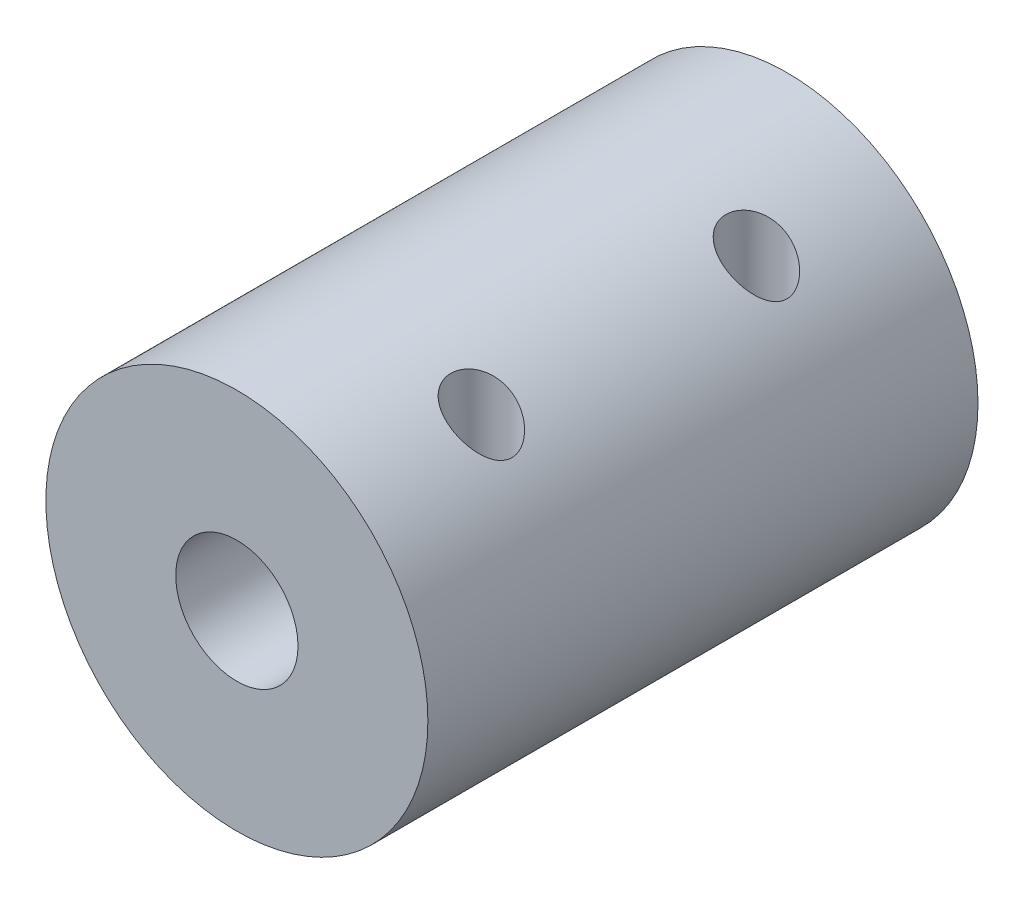
ISO-10303-21;
HEADER;
FILE_DESCRIPTION(('STEP AP214'),'2;1');
FILE_NAME('part.step','',(''),(''),'','','');
FILE_SCHEMA(('AUTOMOTIVE_DESIGN { 1 0 10303 214 1 1 1 1 }'));
ENDSEC;
DATA;
#1=APPLICATION_CONTEXT('core data for automotive mechanical design processes');
#2=APPLICATION_PROTOCOL_DEFINITION('international standard','automotive_design',2000,#1);
#3=PRODUCT_CONTEXT('',#1,'mechanical');
#4=PRODUCT('Part','Part','',(#3));
#5=PRODUCT_RELATED_PRODUCT_CATEGORY('part','',(#4));
#6=PRODUCT_DEFINITION_FORMATION('','',#4);
#7=PRODUCT_DEFINITION_CONTEXT('part definition',#1,'design');
#8=PRODUCT_DEFINITION('design','',#6,#7);
#9=PRODUCT_DEFINITION_SHAPE('','',#8);
#10=(LENGTH_UNIT() NAMED_UNIT(*) SI_UNIT(.MILLI.,.METRE.));
#11=(NAMED_UNIT(*) PLANE_ANGLE_UNIT() SI_UNIT($,.RADIAN.));
#12=(NAMED_UNIT(*) SI_UNIT($,.STERADIAN.) SOLID_ANGLE_UNIT());
#13=UNCERTAINTY_MEASURE_WITH_UNIT(LENGTH_MEASURE(1.E-05),#10,'distance_accuracy_value','');
#14=(GEOMETRIC_REPRESENTATION_CONTEXT(3) GLOBAL_UNCERTAINTY_ASSIGNED_CONTEXT((#13)) GLOBAL_UNIT_ASSIGNED_CONTEXT((#10,
#11,#12)) REPRESENTATION_CONTEXT('',''));
#15=CARTESIAN_POINT('',(0.,0.,0.));
#16=DIRECTION('',(0.,0.,1.));
#17=DIRECTION('',(1.,0.,0.));
#18=AXIS2_PLACEMENT_3D('',#15,#16,#17);
#19=CARTESIAN_POINT('',(0.,0.,36.));
#20=DIRECTION('',(0.,0.,-1.));
#21=DIRECTION('',(-1.,0.,0.));
#22=AXIS2_PLACEMENT_3D('',#19,#20,#21);
#23=CYLINDRICAL_SURFACE('',#22,12.5);
#24=CARTESIAN_POINT('',(7.,-10.356157588604,29.));
#25=CARTESIAN_POINT('',(7.14068387193345,-10.2610607831514,28.9999991687884));
#26=CARTESIAN_POINT('',(7.27945191704366,-10.1630485384281,28.9851627128638));
#27=CARTESIAN_POINT('',(7.5493225794935,-9.96423262998421,28.928037127534));
#28=CARTESIAN_POINT('',(7.68041202746763,-9.8634245836727,28.8857022572878));
#29=CARTESIAN_POINT('',(7.93057620345984,-9.66340435584903,28.775543183503));
#30=CARTESIAN_POINT('',(8.04974800522251,-9.56418596724444,28.7079506162662));
#31=CARTESIAN_POINT('',(8.27428923661972,-9.3705917835191,28.5476370368059));
#32=CARTESIAN_POINT('',(8.37968125796683,-9.27620822035086,28.4549579394991));
#33=CARTESIAN_POINT('',(8.54188192502925,-9.12657325446701,28.277537683825));
#34=CARTESIAN_POINT('',(8.60349144749399,-9.06841203731702,28.1996193355585));
#35=CARTESIAN_POINT('',(8.71634059006958,-8.95999383544148,28.0316841714565));
#36=CARTESIAN_POINT('',(8.76759759425184,-8.90972363220626,27.9416880670313));
#37=CARTESIAN_POINT('',(8.84728644704714,-8.83051410239155,27.7709543120237));
#38=CARTESIAN_POINT('',(8.87825805132102,-8.79931346827258,27.6924638163142));
#39=CARTESIAN_POINT('',(8.93057793813701,-8.74620905716096,27.5293252147775));
#40=CARTESIAN_POINT('',(8.95193428226708,-8.72429749296717,27.4446823366279));
#41=CARTESIAN_POINT('',(8.98361868916704,-8.69167046593195,27.2704561851858));
#42=CARTESIAN_POINT('',(8.99385654870469,-8.68104659390032,27.1808386136893));
#43=CARTESIAN_POINT('',(9.00203296103069,-8.67256861283873,27.0004540778367));
#44=CARTESIAN_POINT('',(8.99997814932987,-8.67470761448384,26.9096877599679));
#45=CARTESIAN_POINT('',(8.98480889346025,-8.69041383371224,26.7416133734866));
#46=CARTESIAN_POINT('',(8.97309659702743,-8.70253193303169,26.6640314469692));
#47=CARTESIAN_POINT('',(8.94122473192908,-8.73527444626934,26.5125072360417));
#48=CARTESIAN_POINT('',(8.92106126372871,-8.75590278690913,26.4385666494395));
#49=CARTESIAN_POINT('',(8.86539520735703,-8.8123095566044,26.2717132154406));
#50=CARTESIAN_POINT('',(8.8270197305425,-8.85084614964855,26.1806956486412));
#51=CARTESIAN_POINT('',(8.73968795989364,-8.93709304958367,26.0086148645631));
#52=CARTESIAN_POINT('',(8.69070931490208,-8.98482271137623,25.9275732511951));
#53=CARTESIAN_POINT('',(8.56514136233976,-9.10485068886872,25.7485200915353));
#54=CARTESIAN_POINT('',(8.48494825604652,-9.17982282875852,25.6548392589619));
#55=CARTESIAN_POINT('',(8.31247594685514,-9.33629286145143,25.4860668513366));
#56=CARTESIAN_POINT('',(8.22018564190364,-9.41779672162827,25.4109925374041));
#57=CARTESIAN_POINT('',(8.02357310027397,-9.58589530681733,25.2775796959447));
#58=CARTESIAN_POINT('',(7.91901641129684,-9.67256508575966,25.2196829876754));
#59=CARTESIAN_POINT('',(7.70171754001083,-9.84646846736119,25.1233754677321));
#60=CARTESIAN_POINT('',(7.58897317899799,-9.93370221442289,25.0849698644346));
#61=CARTESIAN_POINT('',(7.33818235453746,-10.120738008913,25.0239166269127));
#62=CARTESIAN_POINT('',(7.19901873913846,-10.2202549905566,25.0048863065314));
#63=CARTESIAN_POINT('',(6.91604469592688,-10.4138183921674,24.9967689762827));
#64=CARTESIAN_POINT('',(6.77223814738207,-10.5078692041919,25.0076575772235));
#65=CARTESIAN_POINT('',(6.5161616144922,-10.6680536438183,25.0560236397253));
#66=CARTESIAN_POINT('',(6.40375035426118,-10.7358454253372,25.0872898217083));
#67=CARTESIAN_POINT('',(6.1827954079844,-10.8645912790763,25.1707658784394));
#68=CARTESIAN_POINT('',(6.07424963648994,-10.9255490775977,25.2229642679118));
#69=CARTESIAN_POINT('',(5.8645605017398,-11.0395326046532,25.3489900884843));
#70=CARTESIAN_POINT('',(5.76347134456054,-11.0925027114384,25.4229594699766));
#71=CARTESIAN_POINT('',(5.57454119432858,-11.1886433911291,25.5914379442593));
#72=CARTESIAN_POINT('',(5.48669208466121,-11.2318199760745,25.6859343657873));
#73=CARTESIAN_POINT('',(5.33894348121724,-11.3027249931006,25.8802093165887));
#74=CARTESIAN_POINT('',(5.27694214638591,-11.331695108258,25.9779389684692));
#75=CARTESIAN_POINT('',(5.17016759663191,-11.3808102147578,26.1844074041899));
#76=CARTESIAN_POINT('',(5.12538346618895,-11.400960798713,26.2931391573929));
#77=CARTESIAN_POINT('',(5.0586153069291,-11.4307316583864,26.5075908106945));
#78=CARTESIAN_POINT('',(5.03491373738841,-11.4411496919547,26.6126686805542));
#79=CARTESIAN_POINT('',(5.00470730439503,-11.4543959309208,26.8257277991635));
#80=CARTESIAN_POINT('',(4.99819731191654,-11.4572264000365,26.9337081722506));
#81=CARTESIAN_POINT('',(5.0025757258797,-11.4553146902739,27.1450358504908));
#82=CARTESIAN_POINT('',(5.01279915176864,-11.4508619485022,27.2484004220872));
#83=CARTESIAN_POINT('',(5.04895867227183,-11.4349640037868,27.4517771009807));
#84=CARTESIAN_POINT('',(5.07489364493005,-11.4235193001361,27.551789447121));
#85=CARTESIAN_POINT('',(5.14141356913551,-11.3937344105042,27.7457732322189));
#86=CARTESIAN_POINT('',(5.18200652777749,-11.3753904554988,27.8397413363219));
#87=CARTESIAN_POINT('',(5.27619990327184,-11.3320074197615,28.0192095279428));
#88=CARTESIAN_POINT('',(5.32980145277784,-11.3069677560172,28.1047088771757));
#89=CARTESIAN_POINT('',(5.45010335028842,-11.2494871275566,28.2682638956897));
#90=CARTESIAN_POINT('',(5.51720596125261,-11.2168120620838,28.3459405294287));
#91=CARTESIAN_POINT('',(5.66066533210741,-11.1451018398242,28.4887710201233));
#92=CARTESIAN_POINT('',(5.73702462739475,-11.1060649395244,28.5539214334659));
#93=CARTESIAN_POINT('',(5.90255428361997,-11.0190395197891,28.6753926101115));
#94=CARTESIAN_POINT('',(5.99225778579438,-10.9705947385086,28.7306571541901));
#95=CARTESIAN_POINT('',(6.17647446366748,-10.8679481490624,28.8255287854253));
#96=CARTESIAN_POINT('',(6.27098922492202,-10.8137444365526,28.8651306727354));
#97=CARTESIAN_POINT('',(6.47126376452669,-10.6952093641346,28.9319948051489));
#98=CARTESIAN_POINT('',(6.57724545122525,-10.6304049492869,28.9577472294249));
#99=CARTESIAN_POINT('',(6.78917306580394,-10.4963282599225,28.9917558442504));
#100=CARTESIAN_POINT('',(6.89511892534949,-10.4270531007521,29.0000006196757));
#101=CARTESIAN_POINT('',(7.,-10.356157588604,29.));
#102=B_SPLINE_CURVE_WITH_KNOTS('',3,(#24,#25,#26,#27,#28,#29,#30,#31,#32,#33,#34,#35,#36,#37,
#38,#39,#40,#41,#42,#43,#44,#45,#46,#47,#48,#49,#50,#51,#52,#53,#54,#55,#56,#57,#58,#59,#60,#61,
#62,#63,#64,#65,#66,#67,#68,#69,#70,#71,#72,#73,#74,#75,#76,#77,#78,#79,#80,#81,#82,#83,#84,#85,
#86,#87,#88,#89,#90,#91,#92,#93,#94,#95,#96,#97,#98,#99,#100,#101),.UNSPECIFIED.,.T.,.F.,(4,2,2,
2,2,2,2,2,2,2,2,2,2,2,2,2,2,2,2,2,2,2,2,2,2,2,2,2,2,2,2,2,2,2,2,2,2,2,4),(0.,0.508942910983598,
1.01873457270369,1.52396135302172,2.0283491492011,2.37258912968714,2.71624616231806,
2.9851176741172,3.25376333802494,3.52457258278402,3.79523565951812,4.03235620136885,
4.26958627590508,4.58592234742726,4.90293185411265,5.33357989902241,5.76462596975843,
6.20595178474925,6.64739546798559,7.16123669072035,7.67465916663005,8.07783786096845,
8.48079563754667,8.88644127596495,9.2918372188986,9.64780382425531,10.0035443770221,
10.3265816113565,10.6495224581642,10.9599384938928,11.2703323655338,11.5808960505646,
11.8914867859781,12.2132646316257,12.5351308118912,12.8816107559385,13.2282056315231,
13.6073799381176,13.9868013935135),.UNSPECIFIED.);
#103=CARTESIAN_POINT('',(7.,-10.356157588604,29.));
#104=VERTEX_POINT('',#103);
#105=EDGE_CURVE('E35',#104,#104,#102,.T.);
#106=ORIENTED_EDGE('',*,*,#105,.T.);
#107=EDGE_LOOP('',(#106));
#108=FACE_BOUND('',#107,.T.);
#109=CARTESIAN_POINT('',(7.,10.356157588604,29.));
#110=CARTESIAN_POINT('',(6.85864170600559,10.4517003004259,28.9999980410257));
#111=CARTESIAN_POINT('',(6.71502019314042,10.5445144214495,28.9850019215207));
#112=CARTESIAN_POINT('',(6.42908294498435,10.721245678618,28.9223553074628));
#113=CARTESIAN_POINT('',(6.28676822293428,10.8051563690134,28.8746813391453));
#114=CARTESIAN_POINT('',(6.05068071029089,10.9385623381134,28.763697209647));
#115=CARTESIAN_POINT('',(5.95464779243153,10.9910442601749,28.7087351146585));
#116=CARTESIAN_POINT('',(5.77070086151919,11.0887247382329,28.5815477478037));
#117=CARTESIAN_POINT('',(5.68277764099052,11.1339315986422,28.5093423962994));
#118=CARTESIAN_POINT('',(5.51825047898149,11.2163921033686,28.3482364307157));
#119=CARTESIAN_POINT('',(5.44170812907981,11.2536029249184,28.2592504926383));
#120=CARTESIAN_POINT('',(5.30426376808096,11.3190373277017,28.0669698566305));
#121=CARTESIAN_POINT('',(5.24335857897028,11.3472627353632,27.9636780727239));
#122=CARTESIAN_POINT('',(5.14525530882304,11.3920584046786,27.7562092138656));
#123=CARTESIAN_POINT('',(5.10638221654841,11.4094669311576,27.6530030137724));
#124=CARTESIAN_POINT('',(5.04602983943971,11.4362882426599,27.4406454786878));
#125=CARTESIAN_POINT('',(5.02454319881512,11.4457044091414,27.33149667875));
#126=CARTESIAN_POINT('',(5.00069463378965,11.4561428411698,27.1171746211857));
#127=CARTESIAN_POINT('',(4.9972971376342,11.4576196708426,27.0121372384528));
#128=CARTESIAN_POINT('',(5.00697782661207,11.4533925825104,26.8029805280116));
#129=CARTESIAN_POINT('',(5.02005340523484,11.4476898005249,26.6988610576882));
#130=CARTESIAN_POINT('',(5.06180617889699,11.4292878784105,26.4960439990539));
#131=CARTESIAN_POINT('',(5.09025440763718,11.4166913816704,26.3972896855164));
#132=CARTESIAN_POINT('',(5.16142399611857,11.3846921274331,26.2062557999199));
#133=CARTESIAN_POINT('',(5.20414576355298,11.3652891755232,26.1139764128944));
#134=CARTESIAN_POINT('',(5.30320233111028,11.3194113236213,25.9363089536228));
#135=CARTESIAN_POINT('',(5.35980442021887,11.2927963341017,25.8511065271126));
#136=CARTESIAN_POINT('',(5.48392220240138,11.233046445824,25.6916717957965));
#137=CARTESIAN_POINT('',(5.55143990884507,11.1999103440107,25.6174415196322));
#138=CARTESIAN_POINT('',(5.69922860195431,11.1254671099667,25.4771823927175));
#139=CARTESIAN_POINT('',(5.7800166915783,11.0837935108601,25.4118947193529));
#140=CARTESIAN_POINT('',(5.9483103842781,10.9943935526225,25.2957653625911));
#141=CARTESIAN_POINT('',(6.03581837634319,10.9466650369425,25.2449288471996));
#142=CARTESIAN_POINT('',(6.22409009157505,10.840825637162,25.1533792827514));
#143=CARTESIAN_POINT('',(6.32529519292712,10.7821522807799,25.1142289475962));
#144=CARTESIAN_POINT('',(6.52969968210528,10.6596085328827,25.0531527200896));
#145=CARTESIAN_POINT('',(6.63289997837478,10.5957357293586,25.0312348726712));
#146=CARTESIAN_POINT('',(6.85332046050655,10.4547308612595,25.0018719043338));
#147=CARTESIAN_POINT('',(6.97048016687871,10.3769945744666,24.9968833004432));
#148=CARTESIAN_POINT('',(7.2015314630778,10.2180069168697,25.0068169076139));
#149=CARTESIAN_POINT('',(7.31542070806022,10.136753123841,25.0217530572665));
#150=CARTESIAN_POINT('',(7.55408934176237,9.96046236894666,25.0738608667545));
#151=CARTESIAN_POINT('',(7.67802712191999,9.86514680786726,25.1139636508165));
#152=CARTESIAN_POINT('',(7.91628559313228,9.67500188546217,25.2174989033131));
#153=CARTESIAN_POINT('',(8.03060152960583,9.58017278600077,25.2809428234389));
#154=CARTESIAN_POINT('',(8.23430014370588,9.40543338674523,25.4220201562348));
#155=CARTESIAN_POINT('',(8.3250360535662,9.32507195580157,25.4971399623461));
#156=CARTESIAN_POINT('',(8.49449440383893,9.17096533331161,25.6655641269851));
#157=CARTESIAN_POINT('',(8.57323563768305,9.09720986774516,25.7588395056513));
#158=CARTESIAN_POINT('',(8.69527211091314,8.98038311114333,25.9350631155241));
#159=CARTESIAN_POINT('',(8.74231167299722,8.93451155648619,26.0135552631989));
#160=CARTESIAN_POINT('',(8.82648724553949,8.85136218036659,26.1798804929067));
#161=CARTESIAN_POINT('',(8.86363808549738,8.81407150221076,26.2676993084357));
#162=CARTESIAN_POINT('',(8.92016812933681,8.75682185775056,26.434951109887));
#163=CARTESIAN_POINT('',(8.94154292806273,8.73495105696351,26.5130461659893));
#164=CARTESIAN_POINT('',(8.97481984481278,8.70075784802403,26.6732569250681));
#165=CARTESIAN_POINT('',(8.9867297448157,8.68842759591436,26.7553692659625));
#166=CARTESIAN_POINT('',(9.00021460789662,8.6744590570228,26.9217146353329));
#167=CARTESIAN_POINT('',(9.00174636081666,8.67286547328162,27.0059550663416));
#168=CARTESIAN_POINT('',(8.9942284621604,8.68066126249797,27.1734473171564));
#169=CARTESIAN_POINT('',(8.98517688880933,8.69005263015952,27.256698954639));
#170=CARTESIAN_POINT('',(8.95807548200982,8.71798280615734,27.4147058815619));
#171=CARTESIAN_POINT('',(8.94060612459052,8.73593081367064,27.4896700102873));
#172=CARTESIAN_POINT('',(8.89800518003137,8.77931816320875,27.6350803001795));
#173=CARTESIAN_POINT('',(8.87287005107822,8.80476096786579,27.7055243546898));
#174=CARTESIAN_POINT('',(8.80298217070603,8.87473477283511,27.8722097408472));
#175=CARTESIAN_POINT('',(8.75451882075659,8.92266892130196,27.9654688822837));
#176=CARTESIAN_POINT('',(8.64656322528866,9.02732672617192,28.1399149584861));
#177=CARTESIAN_POINT('',(8.58704527904121,9.08407081321447,28.2210729500898));
#178=CARTESIAN_POINT('',(8.43733616659391,9.2236131873987,28.3969897530838));
#179=CARTESIAN_POINT('',(8.34361129605056,9.30869125451635,28.4869280669421));
#180=CARTESIAN_POINT('',(8.14382362380456,9.4839799217337,28.645589699835));
#181=CARTESIAN_POINT('',(8.03774469812104,9.5741971490313,28.714284856207));
#182=CARTESIAN_POINT('',(7.81373773105778,9.75791375952374,28.8314193140713));
#183=CARTESIAN_POINT('',(7.69562661201302,9.85144298448163,28.8794598690141));
#184=CARTESIAN_POINT('',(7.45184625847072,10.0370980923894,28.9524203932205));
#185=CARTESIAN_POINT('',(7.3262005066824,10.1292273175613,28.9774085882286));
#186=CARTESIAN_POINT('',(7.16544877163779,10.2424588062209,28.993416346721));
#187=CARTESIAN_POINT('',(7.13256317683276,10.2653859987659,28.9958756199482));
#188=CARTESIAN_POINT('',(7.06649376051978,10.3109786484452,28.9991683520258));
#189=CARTESIAN_POINT('',(7.0333097144162,10.3336438728862,29.0000004616134));
#190=CARTESIAN_POINT('',(7.,10.356157588604,29.));
#191=B_SPLINE_CURVE_WITH_KNOTS('',3,(#109,#110,#111,#112,#113,#114,#115,#116,#117,#118,#119,
#120,#121,#122,#123,#124,#125,#126,#127,#128,#129,#130,#131,#132,#133,#134,#135,#136,#137,#138,
#139,#140,#141,#142,#143,#144,#145,#146,#147,#148,#149,#150,#151,#152,#153,#154,#155,#156,#157,
#158,#159,#160,#161,#162,#163,#164,#165,#166,#167,#168,#169,#170,#171,#172,#173,#174,#175,#176,
#177,#178,#179,#180,#181,#182,#183,#184,#185,#186,#187,#188,#189,#190),.UNSPECIFIED.,.T.,.F.,(4,
2,2,2,2,2,2,2,2,2,2,2,2,2,2,2,2,2,2,2,2,2,2,2,2,2,2,2,2,2,2,2,2,2,2,2,2,2,2,2,4),(0.,
0.511662245727429,1.02369242398268,1.38956169001837,1.75501031115094,2.12236983425078,
2.48965463794703,2.82287029345924,3.15594489960562,3.46972882581538,3.78346310868827,
4.09264836773345,4.40184245875175,4.71753631302062,5.0332884631358,5.36764946286998,
5.70212988638153,6.07074717632292,6.43953645208255,6.85996956603498,7.28069695311549,
7.76292395847885,8.24538787155516,8.6716538326899,9.0972448881698,9.4033167217458,
9.70892693895861,9.95950036159474,10.2098675506127,10.4612765241832,10.7127311569776,
10.9488993050068,11.1851767354401,11.5297954916445,11.8752257120312,12.3386232421084,
12.8026325036062,13.2752361596444,13.7464365684803,13.8669049751243,13.9874732332797),.UNSPECIFIED.);
#192=CARTESIAN_POINT('',(7.,10.356157588604,29.));
#193=VERTEX_POINT('',#192);
#194=EDGE_CURVE('E106',#193,#193,#191,.T.);
#195=ORIENTED_EDGE('',*,*,#194,.T.);
#196=EDGE_LOOP('',(#195));
#197=FACE_BOUND('',#196,.T.);
#198=CARTESIAN_POINT('',(7.,-10.356157588604,11.));
#199=CARTESIAN_POINT('',(7.14068387193345,-10.2610607831514,10.9999991687883));
#200=CARTESIAN_POINT('',(7.27945191704366,-10.1630485384281,10.9851627128638));
#201=CARTESIAN_POINT('',(7.5493225794935,-9.96423262998421,10.928037127534));
#202=CARTESIAN_POINT('',(7.68041202746763,-9.8634245836727,10.8857022572878));
#203=CARTESIAN_POINT('',(7.93057620345984,-9.66340435584903,10.775543183503));
#204=CARTESIAN_POINT('',(8.04974800522251,-9.56418596724444,10.7079506162662));
#205=CARTESIAN_POINT('',(8.27428923661972,-9.3705917835191,10.5476370368059));
#206=CARTESIAN_POINT('',(8.37968125796682,-9.27620822035086,10.4549579394991));
#207=CARTESIAN_POINT('',(8.54188192502925,-9.12657325446701,10.277537683825));
#208=CARTESIAN_POINT('',(8.60349144749399,-9.06841203731702,10.1996193355585));
#209=CARTESIAN_POINT('',(8.71634059006958,-8.95999383544148,10.0316841714565));
#210=CARTESIAN_POINT('',(8.76759759425184,-8.90972363220626,9.94168806703126));
#211=CARTESIAN_POINT('',(8.84728644704714,-8.83051410239155,9.77095431202372));
#212=CARTESIAN_POINT('',(8.87825805132102,-8.79931346827258,9.69246381631422));
#213=CARTESIAN_POINT('',(8.93057793813701,-8.74620905716096,9.52932521477746));
#214=CARTESIAN_POINT('',(8.95193428226707,-8.72429749296717,9.44468233662785));
#215=CARTESIAN_POINT('',(8.98361868916704,-8.69167046593195,9.27045618518575));
#216=CARTESIAN_POINT('',(8.99385654870468,-8.68104659390032,9.18083861368924));
#217=CARTESIAN_POINT('',(9.00203296103069,-8.67256861283873,9.00045407783669));
#218=CARTESIAN_POINT('',(8.99997814932987,-8.67470761448384,8.90968775996793));
#219=CARTESIAN_POINT('',(8.98480889346024,-8.69041383371224,8.74161337348663));
#220=CARTESIAN_POINT('',(8.97309659702743,-8.70253193303169,8.66403144696915));
#221=CARTESIAN_POINT('',(8.94122473192908,-8.73527444626935,8.51250723604164));
#222=CARTESIAN_POINT('',(8.92106126372871,-8.75590278690913,8.43856664943952));
#223=CARTESIAN_POINT('',(8.86539520735703,-8.8123095566044,8.27171321544061));
#224=CARTESIAN_POINT('',(8.8270197305425,-8.85084614964855,8.18069564864117));
#225=CARTESIAN_POINT('',(8.73968795989363,-8.93709304958368,8.00861486456303));
#226=CARTESIAN_POINT('',(8.69070931490207,-8.98482271137624,7.92757325119505));
#227=CARTESIAN_POINT('',(8.56514136233975,-9.10485068886872,7.74852009153527));
#228=CARTESIAN_POINT('',(8.48494825604652,-9.17982282875853,7.65483925896191));
#229=CARTESIAN_POINT('',(8.31247594685513,-9.33629286145143,7.48606685133654));
#230=CARTESIAN_POINT('',(8.22018564190364,-9.41779672162827,7.4109925374041));
#231=CARTESIAN_POINT('',(8.02357310027397,-9.58589530681733,7.27757969594472));
#232=CARTESIAN_POINT('',(7.91901641129684,-9.67256508575966,7.21968298767541));
#233=CARTESIAN_POINT('',(7.70171754001082,-9.84646846736119,7.12337546773208));
#234=CARTESIAN_POINT('',(7.58897317899798,-9.93370221442289,7.08496986443462));
#235=CARTESIAN_POINT('',(7.33818235453745,-10.120738008913,7.02391662691266));
#236=CARTESIAN_POINT('',(7.19901873913845,-10.2202549905566,7.00488630653143));
#237=CARTESIAN_POINT('',(6.91604469592688,-10.4138183921674,6.99676897628271));
#238=CARTESIAN_POINT('',(6.77223814738206,-10.5078692041919,7.0076575772235));
#239=CARTESIAN_POINT('',(6.51616161449219,-10.6680536438183,7.05602363972526));
#240=CARTESIAN_POINT('',(6.40375035426118,-10.7358454253372,7.08728982170824));
#241=CARTESIAN_POINT('',(6.18279540798439,-10.8645912790763,7.17076587843936));
#242=CARTESIAN_POINT('',(6.07424963648993,-10.9255490775977,7.22296426791179));
#243=CARTESIAN_POINT('',(5.86456050173979,-11.0395326046532,7.34899008848432));
#244=CARTESIAN_POINT('',(5.76347134456054,-11.0925027114384,7.42295946997661));
#245=CARTESIAN_POINT('',(5.57454119432857,-11.1886433911291,7.59143794425925));
#246=CARTESIAN_POINT('',(5.4866920846612,-11.2318199760745,7.68593436578733));
#247=CARTESIAN_POINT('',(5.33894348121724,-11.3027249931006,7.88020931658869));
#248=CARTESIAN_POINT('',(5.27694214638591,-11.331695108258,7.97793896846915));
#249=CARTESIAN_POINT('',(5.17016759663191,-11.3808102147578,8.18440740418991));
#250=CARTESIAN_POINT('',(5.12538346618895,-11.400960798713,8.29313915739292));
#251=CARTESIAN_POINT('',(5.0586153069291,-11.4307316583864,8.50759081069453));
#252=CARTESIAN_POINT('',(5.03491373738841,-11.4411496919547,8.61266868055422));
#253=CARTESIAN_POINT('',(5.00470730439503,-11.4543959309208,8.82572779916346));
#254=CARTESIAN_POINT('',(4.99819731191654,-11.4572264000365,8.93370817225064));
#255=CARTESIAN_POINT('',(5.0025757258797,-11.4553146902739,9.14503585049081));
#256=CARTESIAN_POINT('',(5.01279915176864,-11.4508619485022,9.24840042208715));
#257=CARTESIAN_POINT('',(5.04895867227183,-11.4349640037868,9.4517771009807));
#258=CARTESIAN_POINT('',(5.07489364493005,-11.4235193001361,9.55178944712102));
#259=CARTESIAN_POINT('',(5.14141356913551,-11.3937344105042,9.74577323221886));
#260=CARTESIAN_POINT('',(5.18200652777749,-11.3753904554988,9.83974133632189));
#261=CARTESIAN_POINT('',(5.27619990327185,-11.3320074197615,10.0192095279428));
#262=CARTESIAN_POINT('',(5.32980145277785,-11.3069677560172,10.1047088771757));
#263=CARTESIAN_POINT('',(5.45010335028843,-11.2494871275566,10.2682638956896));
#264=CARTESIAN_POINT('',(5.51720596125261,-11.2168120620838,10.3459405294287));
#265=CARTESIAN_POINT('',(5.66066533210742,-11.1451018398242,10.4887710201232));
#266=CARTESIAN_POINT('',(5.73702462739475,-11.1060649395244,10.5539214334659));
#267=CARTESIAN_POINT('',(5.90255428361997,-11.0190395197891,10.6753926101115));
#268=CARTESIAN_POINT('',(5.99225778579439,-10.9705947385086,10.7306571541901));
#269=CARTESIAN_POINT('',(6.17647446366749,-10.8679481490624,10.8255287854253));
#270=CARTESIAN_POINT('',(6.27098922492202,-10.8137444365526,10.8651306727354));
#271=CARTESIAN_POINT('',(6.47126376452669,-10.6952093641346,10.9319948051488));
#272=CARTESIAN_POINT('',(6.57724545122526,-10.6304049492869,10.9577472294249));
#273=CARTESIAN_POINT('',(6.78917306580394,-10.4963282599225,10.9917558442503));
#274=CARTESIAN_POINT('',(6.89511892534949,-10.4270531007521,11.0000006196757));
#275=CARTESIAN_POINT('',(7.,-10.356157588604,11.));
#276=B_SPLINE_CURVE_WITH_KNOTS('',3,(#198,#199,#200,#201,#202,#203,#204,#205,#206,#207,#208,
#209,#210,#211,#212,#213,#214,#215,#216,#217,#218,#219,#220,#221,#222,#223,#224,#225,#226,#227,
#228,#229,#230,#231,#232,#233,#234,#235,#236,#237,#238,#239,#240,#241,#242,#243,#244,#245,#246,
#247,#248,#249,#250,#251,#252,#253,#254,#255,#256,#257,#258,#259,#260,#261,#262,#263,#264,#265,
#266,#267,#268,#269,#270,#271,#272,#273,#274,#275),.UNSPECIFIED.,.T.,.F.,(4,2,2,2,2,2,2,2,2,2,2,
2,2,2,2,2,2,2,2,2,2,2,2,2,2,2,2,2,2,2,2,2,2,2,2,2,2,2,4),(0.,0.508942910983598,1.01873457270368,
1.52396135302172,2.0283491492011,2.37258912968714,2.71624616231806,2.9851176741172,
3.25376333802494,3.52457258278402,3.79523565951812,4.03235620136884,4.26958627590508,
4.58592234742726,4.90293185411265,5.33357989902241,5.76462596975843,6.20595178474925,
6.64739546798559,7.16123669072035,7.67465916663005,8.07783786096845,8.48079563754667,
8.88644127596495,9.29183721889859,9.64780382425531,10.0035443770221,10.3265816113565,
10.6495224581642,10.9599384938928,11.2703323655338,11.5808960505646,11.8914867859781,
12.2132646316257,12.5351308118912,12.8816107559385,13.2282056315231,13.6073799381176,
13.9868013935135),.UNSPECIFIED.);
#277=CARTESIAN_POINT('',(7.,-10.356157588604,11.));
#278=VERTEX_POINT('',#277);
#279=EDGE_CURVE('E57',#278,#278,#276,.T.);
#280=ORIENTED_EDGE('',*,*,#279,.T.);
#281=EDGE_LOOP('',(#280));
#282=FACE_BOUND('',#281,.T.);
#283=CARTESIAN_POINT('',(7.,10.356157588604,11.));
#284=CARTESIAN_POINT('',(6.85864170600559,10.4517003004259,10.9999980410257));
#285=CARTESIAN_POINT('',(6.71502019314042,10.5445144214494,10.9850019215206));
#286=CARTESIAN_POINT('',(6.42908294498435,10.721245678618,10.9223553074627));
#287=CARTESIAN_POINT('',(6.28676822293428,10.8051563690134,10.8746813391453));
#288=CARTESIAN_POINT('',(6.05068071029089,10.9385623381134,10.763697209647));
#289=CARTESIAN_POINT('',(5.95464779243153,10.9910442601749,10.7087351146585));
#290=CARTESIAN_POINT('',(5.77070086151919,11.0887247382329,10.5815477478037));
#291=CARTESIAN_POINT('',(5.68277764099052,11.1339315986422,10.5093423962993));
#292=CARTESIAN_POINT('',(5.51825047898149,11.2163921033686,10.3482364307157));
#293=CARTESIAN_POINT('',(5.44170812907981,11.2536029249184,10.2592504926383));
#294=CARTESIAN_POINT('',(5.30426376808096,11.3190373277017,10.0669698566305));
#295=CARTESIAN_POINT('',(5.24335857897029,11.3472627353632,9.96367807272388));
#296=CARTESIAN_POINT('',(5.14525530882305,11.3920584046786,9.7562092138656));
#297=CARTESIAN_POINT('',(5.10638221654841,11.4094669311576,9.65300301377238));
#298=CARTESIAN_POINT('',(5.04602983943971,11.4362882426599,9.4406454786878));
#299=CARTESIAN_POINT('',(5.02454319881513,11.4457044091414,9.33149667874996));
#300=CARTESIAN_POINT('',(5.00069463378965,11.4561428411698,9.11717462118571));
#301=CARTESIAN_POINT('',(4.99729713763421,11.4576196708426,9.01213723845277));
#302=CARTESIAN_POINT('',(5.00697782661207,11.4533925825104,8.8029805280116));
#303=CARTESIAN_POINT('',(5.02005340523484,11.4476898005249,8.69886105768819));
#304=CARTESIAN_POINT('',(5.06180617889699,11.4292878784105,8.49604399905387));
#305=CARTESIAN_POINT('',(5.09025440763718,11.4166913816704,8.39728968551639));
#306=CARTESIAN_POINT('',(5.16142399611857,11.3846921274331,8.20625579991987));
#307=CARTESIAN_POINT('',(5.20414576355298,11.3652891755232,8.11397641289443));
#308=CARTESIAN_POINT('',(5.30320233111029,11.3194113236213,7.93630895362278));
#309=CARTESIAN_POINT('',(5.35980442021887,11.2927963341017,7.85110652711263));
#310=CARTESIAN_POINT('',(5.48392220240138,11.233046445824,7.69167179579645));
#311=CARTESIAN_POINT('',(5.55143990884507,11.1999103440107,7.61744151963214));
#312=CARTESIAN_POINT('',(5.69922860195431,11.1254671099667,7.47718239271746));
#313=CARTESIAN_POINT('',(5.7800166915783,11.0837935108601,7.41189471935286));
#314=CARTESIAN_POINT('',(5.9483103842781,10.9943935526225,7.29576536259113));
#315=CARTESIAN_POINT('',(6.03581837634319,10.9466650369425,7.24492884719957));
#316=CARTESIAN_POINT('',(6.22409009157505,10.840825637162,7.15337928275137));
#317=CARTESIAN_POINT('',(6.32529519292712,10.7821522807799,7.11422894759621));
#318=CARTESIAN_POINT('',(6.52969968210529,10.6596085328827,7.05315272008956));
#319=CARTESIAN_POINT('',(6.63289997837478,10.5957357293586,7.03123487267121));
#320=CARTESIAN_POINT('',(6.85332046050655,10.4547308612595,7.00187190433381));
#321=CARTESIAN_POINT('',(6.97048016687871,10.3769945744666,6.99688330044317));
#322=CARTESIAN_POINT('',(7.2015314630778,10.2180069168697,7.0068169076139));
#323=CARTESIAN_POINT('',(7.31542070806022,10.136753123841,7.02175305726646));
#324=CARTESIAN_POINT('',(7.55408934176237,9.96046236894666,7.0738608667545));
#325=CARTESIAN_POINT('',(7.67802712192,9.86514680786725,7.11396365081646));
#326=CARTESIAN_POINT('',(7.91628559313228,9.67500188546217,7.21749890331309));
#327=CARTESIAN_POINT('',(8.03060152960583,9.58017278600077,7.28094282343886));
#328=CARTESIAN_POINT('',(8.23430014370588,9.40543338674523,7.4220201562348));
#329=CARTESIAN_POINT('',(8.3250360535662,9.32507195580157,7.49713996234608));
#330=CARTESIAN_POINT('',(8.49449440383893,9.17096533331161,7.66556412698505));
#331=CARTESIAN_POINT('',(8.57323563768305,9.09720986774516,7.75883950565129));
#332=CARTESIAN_POINT('',(8.69527211091314,8.98038311114334,7.93506311552405));
#333=CARTESIAN_POINT('',(8.74231167299722,8.93451155648619,8.01355526319891));
#334=CARTESIAN_POINT('',(8.82648724553949,8.8513621803666,8.17988049290669));
#335=CARTESIAN_POINT('',(8.86363808549738,8.81407150221076,8.2676993084357));
#336=CARTESIAN_POINT('',(8.92016812933681,8.75682185775057,8.43495110988696));
#337=CARTESIAN_POINT('',(8.94154292806273,8.73495105696352,8.51304616598928));
#338=CARTESIAN_POINT('',(8.97481984481278,8.70075784802403,8.67325692506807));
#339=CARTESIAN_POINT('',(8.9867297448157,8.68842759591436,8.75536926596251));
#340=CARTESIAN_POINT('',(9.00021460789662,8.6744590570228,8.92171463533285));
#341=CARTESIAN_POINT('',(9.00174636081666,8.67286547328162,9.00595506634153));
#342=CARTESIAN_POINT('',(8.99422846216039,8.68066126249797,9.17344731715635));
#343=CARTESIAN_POINT('',(8.98517688880933,8.69005263015953,9.25669895463895));
#344=CARTESIAN_POINT('',(8.95807548200982,8.71798280615734,9.41470588156192));
#345=CARTESIAN_POINT('',(8.94060612459052,8.73593081367064,9.4896700102873));
#346=CARTESIAN_POINT('',(8.89800518003136,8.77931816320875,9.63508030017951));
#347=CARTESIAN_POINT('',(8.87287005107822,8.80476096786579,9.70552435468981));
#348=CARTESIAN_POINT('',(8.80298217070603,8.87473477283511,9.87220974084713));
#349=CARTESIAN_POINT('',(8.75451882075659,8.92266892130196,9.96546888228365));
#350=CARTESIAN_POINT('',(8.64656322528866,9.02732672617191,10.1399149584861));
#351=CARTESIAN_POINT('',(8.58704527904121,9.08407081321447,10.2210729500898));
#352=CARTESIAN_POINT('',(8.43733616659391,9.22361318739871,10.3969897530838));
#353=CARTESIAN_POINT('',(8.34361129605056,9.30869125451635,10.4869280669421));
#354=CARTESIAN_POINT('',(8.14382362380456,9.48397992173369,10.645589699835));
#355=CARTESIAN_POINT('',(8.03774469812104,9.5741971490313,10.714284856207));
#356=CARTESIAN_POINT('',(7.81373773105778,9.75791375952374,10.8314193140713));
#357=CARTESIAN_POINT('',(7.69562661201302,9.85144298448164,10.8794598690141));
#358=CARTESIAN_POINT('',(7.45184625847072,10.0370980923894,10.9524203932205));
#359=CARTESIAN_POINT('',(7.3262005066824,10.1292273175613,10.9774085882286));
#360=CARTESIAN_POINT('',(7.16544877163779,10.2424588062209,10.993416346721));
#361=CARTESIAN_POINT('',(7.13256317683276,10.2653859987659,10.9958756199481));
#362=CARTESIAN_POINT('',(7.06649376051979,10.3109786484452,10.9991683520258));
#363=CARTESIAN_POINT('',(7.03330971441621,10.3336438728862,11.0000004616134));
#364=CARTESIAN_POINT('',(7.,10.356157588604,11.));
#365=B_SPLINE_CURVE_WITH_KNOTS('',3,(#283,#284,#285,#286,#287,#288,#289,#290,#291,#292,#293,
#294,#295,#296,#297,#298,#299,#300,#301,#302,#303,#304,#305,#306,#307,#308,#309,#310,#311,#312,
#313,#314,#315,#316,#317,#318,#319,#320,#321,#322,#323,#324,#325,#326,#327,#328,#329,#330,#331,
#332,#333,#334,#335,#336,#337,#338,#339,#340,#341,#342,#343,#344,#345,#346,#347,#348,#349,#350,
#351,#352,#353,#354,#355,#356,#357,#358,#359,#360,#361,#362,#363,#364),.UNSPECIFIED.,.T.,.F.,(4,
2,2,2,2,2,2,2,2,2,2,2,2,2,2,2,2,2,2,2,2,2,2,2,2,2,2,2,2,2,2,2,2,2,2,2,2,2,2,2,4),(0.,
0.511662245727428,1.02369242398268,1.38956169001837,1.75501031115094,2.12236983425078,
2.48965463794703,2.82287029345923,3.15594489960562,3.46972882581538,3.78346310868826,
4.09264836773345,4.40184245875175,4.71753631302061,5.03328846313579,5.36764946286997,
5.70212988638153,6.07074717632292,6.43953645208254,6.85996956603498,7.28069695311548,
7.76292395847884,8.24538787155516,8.67165383268989,9.09724488816979,9.40331672174579,
9.70892693895859,9.95950036159472,10.2098675506127,10.4612765241832,10.7127311569776,
10.9488993050068,11.18517673544,11.5297954916445,11.8752257120312,12.3386232421083,
12.8026325036061,13.2752361596444,13.7464365684803,13.8669049751243,13.9874732332797),.UNSPECIFIED.);
#366=CARTESIAN_POINT('',(7.,10.356157588604,11.));
#367=VERTEX_POINT('',#366);
#368=EDGE_CURVE('E51',#367,#367,#365,.T.);
#369=ORIENTED_EDGE('',*,*,#368,.T.);
#370=EDGE_LOOP('',(#369));
#371=FACE_BOUND('',#370,.T.);
#372=CARTESIAN_POINT('',(0.,0.,36.));
#373=DIRECTION('',(0.,0.,1.));
#374=DIRECTION('',(1.,0.,0.));
#375=AXIS2_PLACEMENT_3D('',#372,#373,#374);
#376=CIRCLE('',#375,12.5);
#377=CARTESIAN_POINT('',(12.5,0.,36.));
#378=VERTEX_POINT('',#377);
#379=EDGE_CURVE('E10',#378,#378,#376,.T.);
#380=ORIENTED_EDGE('',*,*,#379,.F.);
#381=EDGE_LOOP('',(#380));
#382=FACE_BOUND('',#381,.T.);
#383=CARTESIAN_POINT('',(0.,0.,0.));
#384=DIRECTION('',(0.,0.,1.));
#385=DIRECTION('',(1.,0.,0.));
#386=AXIS2_PLACEMENT_3D('',#383,#384,#385);
#387=CIRCLE('',#386,12.5);
#388=CARTESIAN_POINT('',(12.5,0.,0.));
#389=VERTEX_POINT('',#388);
#390=EDGE_CURVE('E42',#389,#389,#387,.T.);
#391=ORIENTED_EDGE('',*,*,#390,.T.);
#392=EDGE_LOOP('',(#391));
#393=FACE_BOUND('',#392,.T.);
#394=ADVANCED_FACE('F31',(#108,#197,#282,#371,#382,#393),#23,.T.);
#395=CARTESIAN_POINT('',(0.,0.,36.));
#396=DIRECTION('',(0.,0.,1.));
#397=DIRECTION('',(1.,0.,0.));
#398=AXIS2_PLACEMENT_3D('',#395,#396,#397);
#399=PLANE('',#398);
#400=CARTESIAN_POINT('',(0.,0.,36.));
#401=DIRECTION('',(0.,0.,1.));
#402=DIRECTION('',(1.,0.,0.));
#403=AXIS2_PLACEMENT_3D('',#400,#401,#402);
#404=CIRCLE('',#403,4.);
#405=CARTESIAN_POINT('',(4.,0.,36.));
#406=VERTEX_POINT('',#405);
#407=EDGE_CURVE('E84',#406,#406,#404,.T.);
#408=ORIENTED_EDGE('',*,*,#407,.F.);
#409=EDGE_LOOP('',(#408));
#410=FACE_BOUND('',#409,.T.);
#411=ORIENTED_EDGE('',*,*,#379,.T.);
#412=EDGE_LOOP('',(#411));
#413=FACE_BOUND('',#412,.T.);
#414=ADVANCED_FACE('F74',(#410,#413),#399,.T.);
#415=CARTESIAN_POINT('',(0.,0.,0.));
#416=DIRECTION('',(0.,0.,1.));
#417=DIRECTION('',(1.,0.,0.));
#418=AXIS2_PLACEMENT_3D('',#415,#416,#417);
#419=PLANE('',#418);
#420=CARTESIAN_POINT('',(0.,0.,0.));
#421=DIRECTION('',(0.,0.,1.));
#422=DIRECTION('',(1.,0.,0.));
#423=AXIS2_PLACEMENT_3D('',#420,#421,#422);
#424=CIRCLE('',#423,4.);
#425=CARTESIAN_POINT('',(4.,0.,0.));
#426=VERTEX_POINT('',#425);
#427=EDGE_CURVE('E47',#426,#426,#424,.T.);
#428=ORIENTED_EDGE('',*,*,#427,.T.);
#429=EDGE_LOOP('',(#428));
#430=FACE_BOUND('',#429,.T.);
#431=ORIENTED_EDGE('',*,*,#390,.F.);
#432=EDGE_LOOP('',(#431));
#433=FACE_BOUND('',#432,.T.);
#434=ADVANCED_FACE('F71',(#430,#433),#419,.F.);
#435=CARTESIAN_POINT('',(0.,0.,0.));
#436=DIRECTION('',(0.,0.,1.));
#437=DIRECTION('',(1.,0.,0.));
#438=AXIS2_PLACEMENT_3D('',#435,#436,#437);
#439=CYLINDRICAL_SURFACE('',#438,4.);
#440=ORIENTED_EDGE('',*,*,#427,.F.);
#441=EDGE_LOOP('',(#440));
#442=FACE_BOUND('',#441,.T.);
#443=ORIENTED_EDGE('',*,*,#407,.T.);
#444=EDGE_LOOP('',(#443));
#445=FACE_BOUND('',#444,.T.);
#446=ADVANCED_FACE('F65',(#442,#445),#439,.F.);
#447=CARTESIAN_POINT('',(7.,-12.5,9.00000000000001));
#448=DIRECTION('',(0.,1.,0.));
#449=DIRECTION('',(0.,0.,1.));
#450=AXIS2_PLACEMENT_3D('',#447,#448,#449);
#451=CYLINDRICAL_SURFACE('',#450,2.);
#452=ORIENTED_EDGE('',*,*,#368,.F.);
#453=EDGE_LOOP('',(#452));
#454=FACE_BOUND('',#453,.T.);
#455=ORIENTED_EDGE('',*,*,#279,.F.);
#456=EDGE_LOOP('',(#455));
#457=FACE_BOUND('',#456,.T.);
#458=ADVANCED_FACE('F60',(#454,#457),#451,.F.);
#459=CARTESIAN_POINT('',(7.,-12.5,27.));
#460=DIRECTION('',(0.,1.,0.));
#461=DIRECTION('',(0.,0.,1.));
#462=AXIS2_PLACEMENT_3D('',#459,#460,#461);
#463=CYLINDRICAL_SURFACE('',#462,2.);
#464=ORIENTED_EDGE('',*,*,#194,.F.);
#465=EDGE_LOOP('',(#464));
#466=FACE_BOUND('',#465,.T.);
#467=ORIENTED_EDGE('',*,*,#105,.F.);
#468=EDGE_LOOP('',(#467));
#469=FACE_BOUND('',#468,.T.);
#470=ADVANCED_FACE('F64',(#466,#469),#463,.F.);
#471=CLOSED_SHELL('',(#394,#414,#434,#446,#458,#470));
#472=MANIFOLD_SOLID_BREP('B2',#471);
#473=ADVANCED_BREP_SHAPE_REPRESENTATION('',(#18,#472),#14);
#474=SHAPE_DEFINITION_REPRESENTATION(#9,#473);
ENDSEC;
END-ISO-10303-21;
